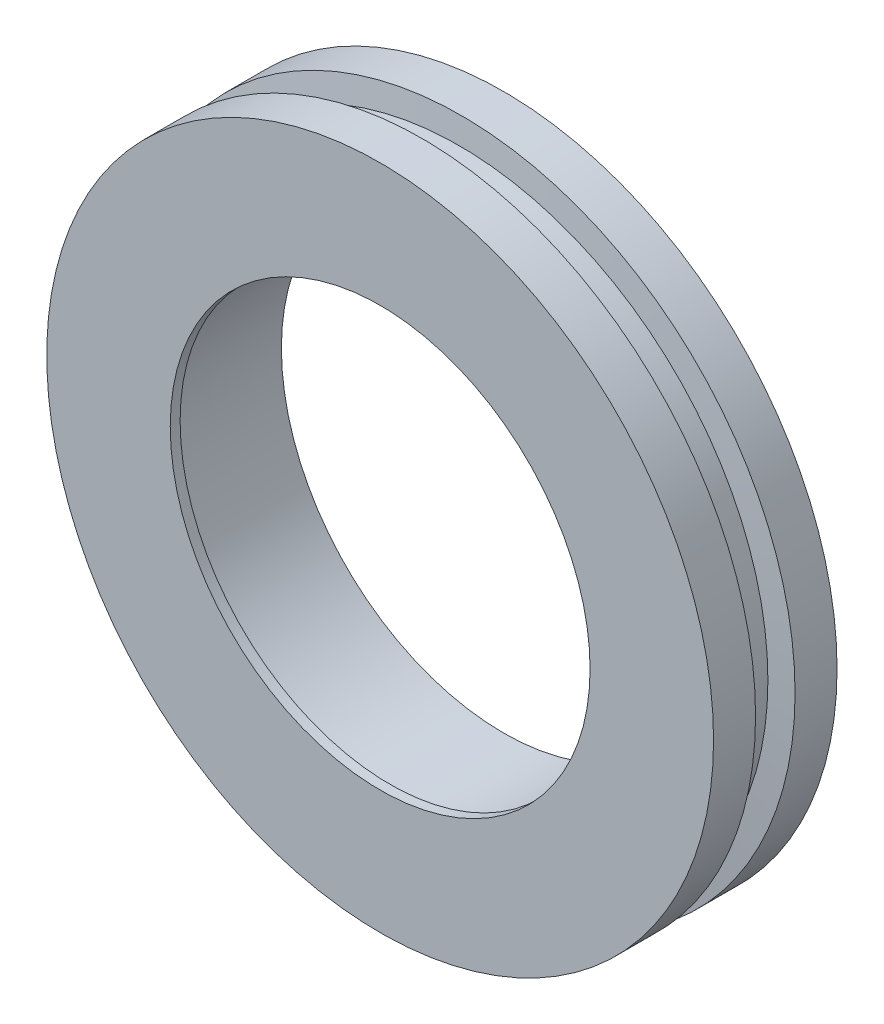
ISO-10303-21;
HEADER;
FILE_DESCRIPTION(('STEP AP214'),'2;1');
FILE_NAME('part.step','',(''),(''),'','','');
FILE_SCHEMA(('AUTOMOTIVE_DESIGN { 1 0 10303 214 1 1 1 1 }'));
ENDSEC;
DATA;
#1=APPLICATION_CONTEXT('core data for automotive mechanical design processes');
#2=APPLICATION_PROTOCOL_DEFINITION('international standard','automotive_design',2000,#1);
#3=PRODUCT_CONTEXT('',#1,'mechanical');
#4=PRODUCT('Part','Part','',(#3));
#5=PRODUCT_RELATED_PRODUCT_CATEGORY('part','',(#4));
#6=PRODUCT_DEFINITION_FORMATION('','',#4);
#7=PRODUCT_DEFINITION_CONTEXT('part definition',#1,'design');
#8=PRODUCT_DEFINITION('design','',#6,#7);
#9=PRODUCT_DEFINITION_SHAPE('','',#8);
#10=(LENGTH_UNIT() NAMED_UNIT(*) SI_UNIT(.MILLI.,.METRE.));
#11=(NAMED_UNIT(*) PLANE_ANGLE_UNIT() SI_UNIT($,.RADIAN.));
#12=(NAMED_UNIT(*) SI_UNIT($,.STERADIAN.) SOLID_ANGLE_UNIT());
#13=UNCERTAINTY_MEASURE_WITH_UNIT(LENGTH_MEASURE(1.E-05),#10,'distance_accuracy_value','');
#14=(GEOMETRIC_REPRESENTATION_CONTEXT(3) GLOBAL_UNCERTAINTY_ASSIGNED_CONTEXT((#13)) GLOBAL_UNIT_ASSIGNED_CONTEXT((#10,
#11,#12)) REPRESENTATION_CONTEXT('',''));
#15=CARTESIAN_POINT('',(0.,0.,0.));
#16=DIRECTION('',(0.,0.,1.));
#17=DIRECTION('',(1.,0.,0.));
#18=AXIS2_PLACEMENT_3D('',#15,#16,#17);
#19=CARTESIAN_POINT('',(0.,0.,0.));
#20=DIRECTION('',(0.,0.,-1.));
#21=DIRECTION('',(1.,0.,0.));
#22=AXIS2_PLACEMENT_3D('',#19,#20,#21);
#23=CYLINDRICAL_SURFACE('',#22,67.5);
#24=CARTESIAN_POINT('',(0.,0.,8.5));
#25=DIRECTION('',(0.,0.,1.));
#26=DIRECTION('',(1.,0.,0.));
#27=AXIS2_PLACEMENT_3D('',#24,#25,#26);
#28=CIRCLE('',#27,67.5);
#29=CARTESIAN_POINT('',(67.5,0.,8.5));
#30=VERTEX_POINT('',#29);
#31=EDGE_CURVE('E83',#30,#30,#28,.T.);
#32=ORIENTED_EDGE('',*,*,#31,.F.);
#33=EDGE_LOOP('',(#32));
#34=FACE_BOUND('',#33,.T.);
#35=CARTESIAN_POINT('',(0.,0.,0.));
#36=DIRECTION('',(0.,0.,1.));
#37=DIRECTION('',(1.,0.,0.));
#38=AXIS2_PLACEMENT_3D('',#35,#36,#37);
#39=CIRCLE('',#38,67.5);
#40=CARTESIAN_POINT('',(67.5,0.,0.));
#41=VERTEX_POINT('',#40);
#42=EDGE_CURVE('E113',#41,#41,#39,.T.);
#43=ORIENTED_EDGE('',*,*,#42,.T.);
#44=EDGE_LOOP('',(#43));
#45=FACE_BOUND('',#44,.T.);
#46=ADVANCED_FACE('F39',(#34,#45),#23,.T.);
#47=CARTESIAN_POINT('',(67.5,0.,0.));
#48=DIRECTION('',(0.,0.,-1.));
#49=DIRECTION('',(1.,0.,0.));
#50=AXIS2_PLACEMENT_3D('',#47,#48,#49);
#51=PLANE('',#50);
#52=CARTESIAN_POINT('',(-43.3012701892216,25.0000000000005,0.));
#53=DIRECTION('',(0.,0.,1.));
#54=DIRECTION('',(1.,0.,0.));
#55=AXIS2_PLACEMENT_3D('',#52,#53,#54);
#56=CIRCLE('',#55,2.5);
#57=CARTESIAN_POINT('',(-40.8012701892216,25.0000000000005,0.));
#58=VERTEX_POINT('',#57);
#59=EDGE_CURVE('E77',#58,#58,#56,.T.);
#60=ORIENTED_EDGE('',*,*,#59,.T.);
#61=EDGE_LOOP('',(#60));
#62=FACE_BOUND('',#61,.T.);
#63=CARTESIAN_POINT('',(-43.3012701892222,-24.9999999999996,0.));
#64=DIRECTION('',(0.,0.,1.));
#65=DIRECTION('',(1.,0.,0.));
#66=AXIS2_PLACEMENT_3D('',#63,#64,#65);
#67=CIRCLE('',#66,2.5);
#68=CARTESIAN_POINT('',(-40.8012701892222,-24.9999999999996,0.));
#69=VERTEX_POINT('',#68);
#70=EDGE_CURVE('E76',#69,#69,#67,.T.);
#71=ORIENTED_EDGE('',*,*,#70,.T.);
#72=EDGE_LOOP('',(#71));
#73=FACE_BOUND('',#72,.T.);
#74=CARTESIAN_POINT('',(0.,-50.,0.));
#75=DIRECTION('',(0.,0.,1.));
#76=DIRECTION('',(1.,0.,0.));
#77=AXIS2_PLACEMENT_3D('',#74,#75,#76);
#78=CIRCLE('',#77,2.5);
#79=CARTESIAN_POINT('',(2.5,-50.,0.));
#80=VERTEX_POINT('',#79);
#81=EDGE_CURVE('E89',#80,#80,#78,.T.);
#82=ORIENTED_EDGE('',*,*,#81,.T.);
#83=EDGE_LOOP('',(#82));
#84=FACE_BOUND('',#83,.T.);
#85=CARTESIAN_POINT('',(43.3012701892218,-25.0000000000002,0.));
#86=DIRECTION('',(0.,0.,1.));
#87=DIRECTION('',(1.,0.,0.));
#88=AXIS2_PLACEMENT_3D('',#85,#86,#87);
#89=CIRCLE('',#88,2.5);
#90=CARTESIAN_POINT('',(45.8012701892218,-25.0000000000002,0.));
#91=VERTEX_POINT('',#90);
#92=EDGE_CURVE('E95',#91,#91,#89,.T.);
#93=ORIENTED_EDGE('',*,*,#92,.T.);
#94=EDGE_LOOP('',(#93));
#95=FACE_BOUND('',#94,.T.);
#96=CARTESIAN_POINT('',(43.301270189222,24.9999999999999,0.));
#97=DIRECTION('',(0.,0.,1.));
#98=DIRECTION('',(1.,0.,0.));
#99=AXIS2_PLACEMENT_3D('',#96,#97,#98);
#100=CIRCLE('',#99,2.5);
#101=CARTESIAN_POINT('',(45.801270189222,24.9999999999999,0.));
#102=VERTEX_POINT('',#101);
#103=EDGE_CURVE('E101',#102,#102,#100,.T.);
#104=ORIENTED_EDGE('',*,*,#103,.T.);
#105=EDGE_LOOP('',(#104));
#106=FACE_BOUND('',#105,.T.);
#107=CARTESIAN_POINT('',(0.,50.,0.));
#108=DIRECTION('',(0.,0.,1.));
#109=DIRECTION('',(1.,0.,0.));
#110=AXIS2_PLACEMENT_3D('',#107,#108,#109);
#111=CIRCLE('',#110,2.5);
#112=CARTESIAN_POINT('',(2.5,50.,0.));
#113=VERTEX_POINT('',#112);
#114=EDGE_CURVE('E107',#113,#113,#111,.T.);
#115=ORIENTED_EDGE('',*,*,#114,.T.);
#116=EDGE_LOOP('',(#115));
#117=FACE_BOUND('',#116,.T.);
#118=ORIENTED_EDGE('',*,*,#42,.F.);
#119=EDGE_LOOP('',(#118));
#120=FACE_BOUND('',#119,.T.);
#121=CARTESIAN_POINT('',(0.,0.,0.));
#122=DIRECTION('',(0.,0.,1.));
#123=DIRECTION('',(1.,0.,0.));
#124=AXIS2_PLACEMENT_3D('',#121,#122,#123);
#125=CIRCLE('',#124,45.);
#126=CARTESIAN_POINT('',(45.,0.,0.));
#127=VERTEX_POINT('',#126);
#128=EDGE_CURVE('E11',#127,#127,#125,.T.);
#129=ORIENTED_EDGE('',*,*,#128,.T.);
#130=EDGE_LOOP('',(#129));
#131=FACE_BOUND('',#130,.T.);
#132=ADVANCED_FACE('F41',(#62,#73,#84,#95,#106,#117,#120,#131),#51,.T.);
#133=CARTESIAN_POINT('',(0.,0.,0.));
#134=DIRECTION('',(0.,0.,-1.));
#135=DIRECTION('',(1.,0.,0.));
#136=AXIS2_PLACEMENT_3D('',#133,#134,#135);
#137=CYLINDRICAL_SURFACE('',#136,45.);
#138=ORIENTED_EDGE('',*,*,#128,.F.);
#139=EDGE_LOOP('',(#138));
#140=FACE_BOUND('',#139,.T.);
#141=CARTESIAN_POINT('',(0.,0.,23.));
#142=DIRECTION('',(0.,0.,1.));
#143=DIRECTION('',(1.,0.,0.));
#144=AXIS2_PLACEMENT_3D('',#141,#142,#143);
#145=CIRCLE('',#144,45.);
#146=CARTESIAN_POINT('',(45.,0.,23.));
#147=VERTEX_POINT('',#146);
#148=EDGE_CURVE('E47',#147,#147,#145,.T.);
#149=ORIENTED_EDGE('',*,*,#148,.T.);
#150=EDGE_LOOP('',(#149));
#151=FACE_BOUND('',#150,.T.);
#152=ADVANCED_FACE('F127',(#140,#151),#137,.F.);
#153=CARTESIAN_POINT('',(45.,0.,23.));
#154=DIRECTION('',(0.,0.,-1.));
#155=DIRECTION('',(1.,0.,0.));
#156=AXIS2_PLACEMENT_3D('',#153,#154,#155);
#157=PLANE('',#156);
#158=ORIENTED_EDGE('',*,*,#148,.F.);
#159=EDGE_LOOP('',(#158));
#160=FACE_BOUND('',#159,.T.);
#161=CARTESIAN_POINT('',(0.,0.,23.));
#162=DIRECTION('',(0.,0.,1.));
#163=DIRECTION('',(1.,0.,0.));
#164=AXIS2_PLACEMENT_3D('',#161,#162,#163);
#165=CIRCLE('',#164,42.5);
#166=CARTESIAN_POINT('',(42.5,0.,23.));
#167=VERTEX_POINT('',#166);
#168=EDGE_CURVE('E122',#167,#167,#165,.T.);
#169=ORIENTED_EDGE('',*,*,#168,.T.);
#170=EDGE_LOOP('',(#169));
#171=FACE_BOUND('',#170,.T.);
#172=ADVANCED_FACE('F129',(#160,#171),#157,.T.);
#173=CARTESIAN_POINT('',(0.,0.,0.));
#174=DIRECTION('',(0.,0.,-1.));
#175=DIRECTION('',(1.,0.,0.));
#176=AXIS2_PLACEMENT_3D('',#173,#174,#175);
#177=CYLINDRICAL_SURFACE('',#176,42.5);
#178=ORIENTED_EDGE('',*,*,#168,.F.);
#179=EDGE_LOOP('',(#178));
#180=FACE_BOUND('',#179,.T.);
#181=CARTESIAN_POINT('',(0.,0.,25.));
#182=DIRECTION('',(0.,0.,1.));
#183=DIRECTION('',(1.,0.,0.));
#184=AXIS2_PLACEMENT_3D('',#181,#182,#183);
#185=CIRCLE('',#184,42.5);
#186=CARTESIAN_POINT('',(42.5,0.,25.));
#187=VERTEX_POINT('',#186);
#188=EDGE_CURVE('E119',#187,#187,#185,.T.);
#189=ORIENTED_EDGE('',*,*,#188,.T.);
#190=EDGE_LOOP('',(#189));
#191=FACE_BOUND('',#190,.T.);
#192=ADVANCED_FACE('F132',(#180,#191),#177,.F.);
#193=CARTESIAN_POINT('',(42.5,0.,25.));
#194=DIRECTION('',(0.,0.,1.));
#195=DIRECTION('',(-1.,0.,0.));
#196=AXIS2_PLACEMENT_3D('',#193,#194,#195);
#197=PLANE('',#196);
#198=ORIENTED_EDGE('',*,*,#188,.F.);
#199=EDGE_LOOP('',(#198));
#200=FACE_BOUND('',#199,.T.);
#201=CARTESIAN_POINT('',(0.,0.,25.));
#202=DIRECTION('',(0.,0.,1.));
#203=DIRECTION('',(1.,0.,0.));
#204=AXIS2_PLACEMENT_3D('',#201,#202,#203);
#205=CIRCLE('',#204,67.5);
#206=CARTESIAN_POINT('',(67.5,0.,25.));
#207=VERTEX_POINT('',#206);
#208=EDGE_CURVE('E116',#207,#207,#205,.T.);
#209=ORIENTED_EDGE('',*,*,#208,.T.);
#210=EDGE_LOOP('',(#209));
#211=FACE_BOUND('',#210,.T.);
#212=ADVANCED_FACE('F138',(#200,#211),#197,.T.);
#213=CARTESIAN_POINT('',(0.,0.,16.5));
#214=DIRECTION('',(0.,0.,1.));
#215=DIRECTION('',(1.,0.,0.));
#216=AXIS2_PLACEMENT_3D('',#213,#214,#215);
#217=CIRCLE('',#216,67.5);
#218=CARTESIAN_POINT('',(67.5,0.,16.5));
#219=VERTEX_POINT('',#218);
#220=EDGE_CURVE('E351',#219,#219,#217,.T.);
#221=ORIENTED_EDGE('',*,*,#220,.T.);
#222=EDGE_LOOP('',(#221));
#223=FACE_BOUND('',#222,.T.);
#224=ORIENTED_EDGE('',*,*,#208,.F.);
#225=EDGE_LOOP('',(#224));
#226=FACE_BOUND('',#225,.T.);
#227=ADVANCED_FACE('F144',(#223,#226),#23,.T.);
#228=CARTESIAN_POINT('',(0.,50.,15.));
#229=DIRECTION('',(0.,0.,-1.));
#230=DIRECTION('',(1.,0.,0.));
#231=AXIS2_PLACEMENT_3D('',#228,#229,#230);
#232=CONICAL_SURFACE('',#231,2.5,1.02974425867665);
#233=CARTESIAN_POINT('',(0.,50.,16.5021515475689));
#234=VERTEX_POINT('',#233);
#235=VERTEX_LOOP('',#234);
#236=FACE_BOUND('',#235,.T.);
#237=CARTESIAN_POINT('',(0.,50.,15.));
#238=DIRECTION('',(0.,0.,1.));
#239=DIRECTION('',(1.,0.,0.));
#240=AXIS2_PLACEMENT_3D('',#237,#238,#239);
#241=CIRCLE('',#240,2.5);
#242=CARTESIAN_POINT('',(2.5,50.,15.));
#243=VERTEX_POINT('',#242);
#244=EDGE_CURVE('E110',#243,#243,#241,.T.);
#245=ORIENTED_EDGE('',*,*,#244,.F.);
#246=EDGE_LOOP('',(#245));
#247=FACE_BOUND('',#246,.T.);
#248=ADVANCED_FACE('F149',(#236,#247),#232,.F.);
#249=CARTESIAN_POINT('',(0.,50.,0.));
#250=DIRECTION('',(0.,0.,-1.));
#251=DIRECTION('',(1.,0.,0.));
#252=AXIS2_PLACEMENT_3D('',#249,#250,#251);
#253=CYLINDRICAL_SURFACE('',#252,2.5);
#254=ORIENTED_EDGE('',*,*,#244,.T.);
#255=EDGE_LOOP('',(#254));
#256=FACE_BOUND('',#255,.T.);
#257=ORIENTED_EDGE('',*,*,#114,.F.);
#258=EDGE_LOOP('',(#257));
#259=FACE_BOUND('',#258,.T.);
#260=ADVANCED_FACE('F155',(#256,#259),#253,.F.);
#261=CARTESIAN_POINT('',(43.301270189222,24.9999999999999,15.));
#262=DIRECTION('',(0.,0.,-1.));
#263=DIRECTION('',(1.,0.,0.));
#264=AXIS2_PLACEMENT_3D('',#261,#262,#263);
#265=CONICAL_SURFACE('',#264,2.5,1.02974425867665);
#266=CARTESIAN_POINT('',(43.301270189222,24.9999999999999,16.5021515475689));
#267=VERTEX_POINT('',#266);
#268=VERTEX_LOOP('',#267);
#269=FACE_BOUND('',#268,.T.);
#270=CARTESIAN_POINT('',(43.301270189222,24.9999999999999,15.));
#271=DIRECTION('',(0.,0.,1.));
#272=DIRECTION('',(1.,0.,0.));
#273=AXIS2_PLACEMENT_3D('',#270,#271,#272);
#274=CIRCLE('',#273,2.5);
#275=CARTESIAN_POINT('',(45.801270189222,24.9999999999999,15.));
#276=VERTEX_POINT('',#275);
#277=EDGE_CURVE('E104',#276,#276,#274,.T.);
#278=ORIENTED_EDGE('',*,*,#277,.F.);
#279=EDGE_LOOP('',(#278));
#280=FACE_BOUND('',#279,.T.);
#281=ADVANCED_FACE('F209',(#269,#280),#265,.F.);
#282=CARTESIAN_POINT('',(43.301270189222,24.9999999999999,0.));
#283=DIRECTION('',(0.,0.,-1.));
#284=DIRECTION('',(1.,0.,0.));
#285=AXIS2_PLACEMENT_3D('',#282,#283,#284);
#286=CYLINDRICAL_SURFACE('',#285,2.5);
#287=ORIENTED_EDGE('',*,*,#277,.T.);
#288=EDGE_LOOP('',(#287));
#289=FACE_BOUND('',#288,.T.);
#290=ORIENTED_EDGE('',*,*,#103,.F.);
#291=EDGE_LOOP('',(#290));
#292=FACE_BOUND('',#291,.T.);
#293=ADVANCED_FACE('F221',(#289,#292),#286,.F.);
#294=CARTESIAN_POINT('',(43.3012701892218,-25.0000000000002,15.));
#295=DIRECTION('',(0.,0.,-1.));
#296=DIRECTION('',(1.,0.,0.));
#297=AXIS2_PLACEMENT_3D('',#294,#295,#296);
#298=CONICAL_SURFACE('',#297,2.5,1.02974425867665);
#299=CARTESIAN_POINT('',(43.3012701892218,-25.0000000000002,16.5021515475689));
#300=VERTEX_POINT('',#299);
#301=VERTEX_LOOP('',#300);
#302=FACE_BOUND('',#301,.T.);
#303=CARTESIAN_POINT('',(43.3012701892218,-25.0000000000002,15.));
#304=DIRECTION('',(0.,0.,1.));
#305=DIRECTION('',(1.,0.,0.));
#306=AXIS2_PLACEMENT_3D('',#303,#304,#305);
#307=CIRCLE('',#306,2.5);
#308=CARTESIAN_POINT('',(45.8012701892218,-25.0000000000002,15.));
#309=VERTEX_POINT('',#308);
#310=EDGE_CURVE('E98',#309,#309,#307,.T.);
#311=ORIENTED_EDGE('',*,*,#310,.F.);
#312=EDGE_LOOP('',(#311));
#313=FACE_BOUND('',#312,.T.);
#314=ADVANCED_FACE('F230',(#302,#313),#298,.F.);
#315=CARTESIAN_POINT('',(43.3012701892218,-25.0000000000002,0.));
#316=DIRECTION('',(0.,0.,-1.));
#317=DIRECTION('',(1.,0.,0.));
#318=AXIS2_PLACEMENT_3D('',#315,#316,#317);
#319=CYLINDRICAL_SURFACE('',#318,2.5);
#320=ORIENTED_EDGE('',*,*,#310,.T.);
#321=EDGE_LOOP('',(#320));
#322=FACE_BOUND('',#321,.T.);
#323=ORIENTED_EDGE('',*,*,#92,.F.);
#324=EDGE_LOOP('',(#323));
#325=FACE_BOUND('',#324,.T.);
#326=ADVANCED_FACE('F242',(#322,#325),#319,.F.);
#327=CARTESIAN_POINT('',(0.,-50.,15.));
#328=DIRECTION('',(0.,0.,-1.));
#329=DIRECTION('',(1.,0.,0.));
#330=AXIS2_PLACEMENT_3D('',#327,#328,#329);
#331=CONICAL_SURFACE('',#330,2.5,1.02974425867665);
#332=CARTESIAN_POINT('',(0.,-50.,16.5021515475689));
#333=VERTEX_POINT('',#332);
#334=VERTEX_LOOP('',#333);
#335=FACE_BOUND('',#334,.T.);
#336=CARTESIAN_POINT('',(0.,-50.,15.));
#337=DIRECTION('',(0.,0.,1.));
#338=DIRECTION('',(1.,0.,0.));
#339=AXIS2_PLACEMENT_3D('',#336,#337,#338);
#340=CIRCLE('',#339,2.5);
#341=CARTESIAN_POINT('',(2.5,-50.,15.));
#342=VERTEX_POINT('',#341);
#343=EDGE_CURVE('E92',#342,#342,#340,.T.);
#344=ORIENTED_EDGE('',*,*,#343,.F.);
#345=EDGE_LOOP('',(#344));
#346=FACE_BOUND('',#345,.T.);
#347=ADVANCED_FACE('F252',(#335,#346),#331,.F.);
#348=CARTESIAN_POINT('',(0.,-50.,0.));
#349=DIRECTION('',(0.,0.,-1.));
#350=DIRECTION('',(1.,0.,0.));
#351=AXIS2_PLACEMENT_3D('',#348,#349,#350);
#352=CYLINDRICAL_SURFACE('',#351,2.5);
#353=ORIENTED_EDGE('',*,*,#343,.T.);
#354=EDGE_LOOP('',(#353));
#355=FACE_BOUND('',#354,.T.);
#356=ORIENTED_EDGE('',*,*,#81,.F.);
#357=EDGE_LOOP('',(#356));
#358=FACE_BOUND('',#357,.T.);
#359=ADVANCED_FACE('F264',(#355,#358),#352,.F.);
#360=CARTESIAN_POINT('',(-43.3012701892222,-24.9999999999996,15.));
#361=DIRECTION('',(0.,0.,-1.));
#362=DIRECTION('',(1.,0.,0.));
#363=AXIS2_PLACEMENT_3D('',#360,#361,#362);
#364=CONICAL_SURFACE('',#363,2.5,1.02974425867665);
#365=CARTESIAN_POINT('',(-43.3012701892222,-24.9999999999996,16.5021515475689));
#366=VERTEX_POINT('',#365);
#367=VERTEX_LOOP('',#366);
#368=FACE_BOUND('',#367,.T.);
#369=CARTESIAN_POINT('',(-43.3012701892222,-24.9999999999996,15.));
#370=DIRECTION('',(0.,0.,1.));
#371=DIRECTION('',(1.,0.,0.));
#372=AXIS2_PLACEMENT_3D('',#369,#370,#371);
#373=CIRCLE('',#372,2.5);
#374=CARTESIAN_POINT('',(-40.8012701892222,-24.9999999999996,15.));
#375=VERTEX_POINT('',#374);
#376=EDGE_CURVE('E80',#375,#375,#373,.T.);
#377=ORIENTED_EDGE('',*,*,#376,.F.);
#378=EDGE_LOOP('',(#377));
#379=FACE_BOUND('',#378,.T.);
#380=ADVANCED_FACE('F274',(#368,#379),#364,.F.);
#381=CARTESIAN_POINT('',(-43.3012701892222,-24.9999999999996,0.));
#382=DIRECTION('',(0.,0.,-1.));
#383=DIRECTION('',(1.,0.,0.));
#384=AXIS2_PLACEMENT_3D('',#381,#382,#383);
#385=CYLINDRICAL_SURFACE('',#384,2.5);
#386=ORIENTED_EDGE('',*,*,#376,.T.);
#387=EDGE_LOOP('',(#386));
#388=FACE_BOUND('',#387,.T.);
#389=ORIENTED_EDGE('',*,*,#70,.F.);
#390=EDGE_LOOP('',(#389));
#391=FACE_BOUND('',#390,.T.);
#392=ADVANCED_FACE('F70',(#388,#391),#385,.F.);
#393=CARTESIAN_POINT('',(-43.3012701892216,25.0000000000005,15.));
#394=DIRECTION('',(0.,0.,-1.));
#395=DIRECTION('',(1.,0.,0.));
#396=AXIS2_PLACEMENT_3D('',#393,#394,#395);
#397=CONICAL_SURFACE('',#396,2.5,1.02974425867665);
#398=CARTESIAN_POINT('',(-43.3012701892216,25.0000000000005,16.5021515475689));
#399=VERTEX_POINT('',#398);
#400=VERTEX_LOOP('',#399);
#401=FACE_BOUND('',#400,.T.);
#402=CARTESIAN_POINT('',(-43.3012701892216,25.0000000000005,15.));
#403=DIRECTION('',(0.,0.,1.));
#404=DIRECTION('',(1.,0.,0.));
#405=AXIS2_PLACEMENT_3D('',#402,#403,#404);
#406=CIRCLE('',#405,2.5);
#407=CARTESIAN_POINT('',(-40.8012701892216,25.0000000000005,15.));
#408=VERTEX_POINT('',#407);
#409=EDGE_CURVE('E74',#408,#408,#406,.T.);
#410=ORIENTED_EDGE('',*,*,#409,.F.);
#411=EDGE_LOOP('',(#410));
#412=FACE_BOUND('',#411,.T.);
#413=ADVANCED_FACE('F66',(#401,#412),#397,.F.);
#414=CARTESIAN_POINT('',(-43.3012701892216,25.0000000000005,0.));
#415=DIRECTION('',(0.,0.,-1.));
#416=DIRECTION('',(1.,0.,0.));
#417=AXIS2_PLACEMENT_3D('',#414,#415,#416);
#418=CYLINDRICAL_SURFACE('',#417,2.5);
#419=ORIENTED_EDGE('',*,*,#409,.T.);
#420=EDGE_LOOP('',(#419));
#421=FACE_BOUND('',#420,.T.);
#422=ORIENTED_EDGE('',*,*,#59,.F.);
#423=EDGE_LOOP('',(#422));
#424=FACE_BOUND('',#423,.T.);
#425=ADVANCED_FACE('F69',(#421,#424),#418,.F.);
#426=CARTESIAN_POINT('',(0.,0.,9.));
#427=DIRECTION('',(0.,0.,-1.));
#428=DIRECTION('',(1.,0.,0.));
#429=AXIS2_PLACEMENT_3D('',#426,#427,#428);
#430=CONICAL_SURFACE('',#429,62.5,1.47112767430373);
#431=ORIENTED_EDGE('',*,*,#31,.T.);
#432=EDGE_LOOP('',(#431));
#433=FACE_BOUND('',#432,.T.);
#434=CARTESIAN_POINT('',(0.,0.,9.));
#435=DIRECTION('',(0.,0.,1.));
#436=DIRECTION('',(1.,0.,0.));
#437=AXIS2_PLACEMENT_3D('',#434,#435,#436);
#438=CIRCLE('',#437,62.5);
#439=CARTESIAN_POINT('',(62.5,0.,9.));
#440=VERTEX_POINT('',#439);
#441=EDGE_CURVE('E353',#440,#440,#438,.T.);
#442=ORIENTED_EDGE('',*,*,#441,.F.);
#443=EDGE_LOOP('',(#442));
#444=FACE_BOUND('',#443,.T.);
#445=ADVANCED_FACE('F312',(#433,#444),#430,.T.);
#446=CARTESIAN_POINT('',(0.,0.,0.));
#447=DIRECTION('',(0.,0.,-1.));
#448=DIRECTION('',(1.,0.,0.));
#449=AXIS2_PLACEMENT_3D('',#446,#447,#448);
#450=CYLINDRICAL_SURFACE('',#449,62.5);
#451=ORIENTED_EDGE('',*,*,#441,.T.);
#452=EDGE_LOOP('',(#451));
#453=FACE_BOUND('',#452,.T.);
#454=CARTESIAN_POINT('',(0.,0.,16.));
#455=DIRECTION('',(0.,0.,1.));
#456=DIRECTION('',(1.,0.,0.));
#457=AXIS2_PLACEMENT_3D('',#454,#455,#456);
#458=CIRCLE('',#457,62.5);
#459=CARTESIAN_POINT('',(62.5,0.,16.));
#460=VERTEX_POINT('',#459);
#461=EDGE_CURVE('E349',#460,#460,#458,.T.);
#462=ORIENTED_EDGE('',*,*,#461,.F.);
#463=EDGE_LOOP('',(#462));
#464=FACE_BOUND('',#463,.T.);
#465=ADVANCED_FACE('F322',(#453,#464),#450,.T.);
#466=CARTESIAN_POINT('',(0.,0.,16.5));
#467=DIRECTION('',(0.,0.,1.));
#468=DIRECTION('',(-1.,0.,0.));
#469=AXIS2_PLACEMENT_3D('',#466,#467,#468);
#470=CONICAL_SURFACE('',#469,67.5,1.47112767430373);
#471=ORIENTED_EDGE('',*,*,#461,.T.);
#472=EDGE_LOOP('',(#471));
#473=FACE_BOUND('',#472,.T.);
#474=ORIENTED_EDGE('',*,*,#220,.F.);
#475=EDGE_LOOP('',(#474));
#476=FACE_BOUND('',#475,.T.);
#477=ADVANCED_FACE('F332',(#473,#476),#470,.T.);
#478=CLOSED_SHELL('',(#46,#132,#152,#172,#192,#212,#227,#248,#260,#281,#293,#314,#326,#347,#359,
#380,#392,#413,#425,#445,#465,#477));
#479=MANIFOLD_SOLID_BREP('B2',#478);
#480=ADVANCED_BREP_SHAPE_REPRESENTATION('',(#18,#479),#14);
#481=SHAPE_DEFINITION_REPRESENTATION(#9,#480);
ENDSEC;
END-ISO-10303-21;
